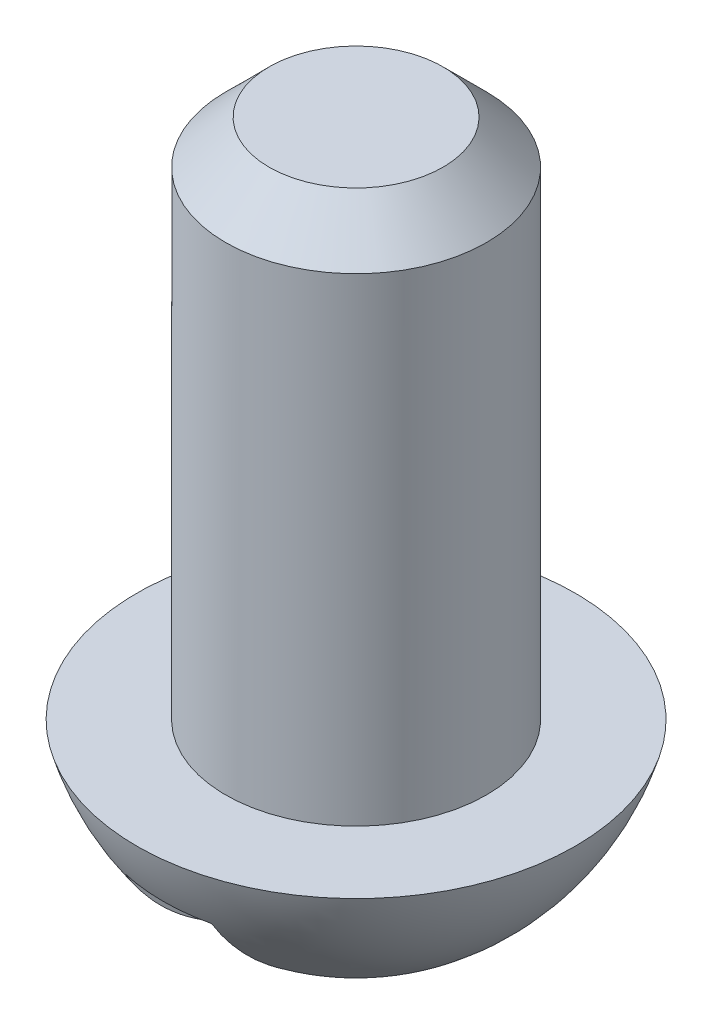
ISO-10303-21;
HEADER;
FILE_DESCRIPTION(('STEP AP214'),'2;1');
FILE_NAME('part.step','',(''),(''),'','','');
FILE_SCHEMA(('AUTOMOTIVE_DESIGN { 1 0 10303 214 1 1 1 1 }'));
ENDSEC;
DATA;
#1=APPLICATION_CONTEXT('core data for automotive mechanical design processes');
#2=APPLICATION_PROTOCOL_DEFINITION('international standard','automotive_design',2000,#1);
#3=PRODUCT_CONTEXT('',#1,'mechanical');
#4=PRODUCT('Part','Part','',(#3));
#5=PRODUCT_RELATED_PRODUCT_CATEGORY('part','',(#4));
#6=PRODUCT_DEFINITION_FORMATION('','',#4);
#7=PRODUCT_DEFINITION_CONTEXT('part definition',#1,'design');
#8=PRODUCT_DEFINITION('design','',#6,#7);
#9=PRODUCT_DEFINITION_SHAPE('','',#8);
#10=(LENGTH_UNIT() NAMED_UNIT(*) SI_UNIT(.MILLI.,.METRE.));
#11=(NAMED_UNIT(*) PLANE_ANGLE_UNIT() SI_UNIT($,.RADIAN.));
#12=(NAMED_UNIT(*) SI_UNIT($,.STERADIAN.) SOLID_ANGLE_UNIT());
#13=UNCERTAINTY_MEASURE_WITH_UNIT(LENGTH_MEASURE(1.E-05),#10,'distance_accuracy_value','');
#14=(GEOMETRIC_REPRESENTATION_CONTEXT(3) GLOBAL_UNCERTAINTY_ASSIGNED_CONTEXT((#13)) GLOBAL_UNIT_ASSIGNED_CONTEXT((#10,
#11,#12)) REPRESENTATION_CONTEXT('',''));
#15=CARTESIAN_POINT('',(0.,0.,0.));
#16=DIRECTION('',(0.,0.,1.));
#17=DIRECTION('',(1.,0.,0.));
#18=AXIS2_PLACEMENT_3D('',#15,#16,#17);
#19=CARTESIAN_POINT('',(0.,6.,0.));
#20=DIRECTION('',(0.,-1.,0.));
#21=DIRECTION('',(0.,0.,-1.));
#22=AXIS2_PLACEMENT_3D('',#19,#20,#21);
#23=CYLINDRICAL_SURFACE('',#22,1.5);
#24=CARTESIAN_POINT('',(0.,5.5,0.));
#25=DIRECTION('',(0.,1.,0.));
#26=DIRECTION('',(0.,0.,1.));
#27=AXIS2_PLACEMENT_3D('',#24,#25,#26);
#28=CIRCLE('',#27,1.5);
#29=CARTESIAN_POINT('',(0.,5.5,1.5));
#30=VERTEX_POINT('',#29);
#31=EDGE_CURVE('E11',#30,#30,#28,.F.);
#32=ORIENTED_EDGE('',*,*,#31,.T.);
#33=EDGE_LOOP('',(#32));
#34=FACE_BOUND('',#33,.T.);
#35=CARTESIAN_POINT('',(0.,0.,0.));
#36=DIRECTION('',(0.,-1.,0.));
#37=DIRECTION('',(1.,0.,0.));
#38=AXIS2_PLACEMENT_3D('',#35,#36,#37);
#39=CIRCLE('',#38,1.5);
#40=CARTESIAN_POINT('',(1.5,0.,0.));
#41=VERTEX_POINT('',#40);
#42=EDGE_CURVE('E65',#41,#41,#39,.T.);
#43=ORIENTED_EDGE('',*,*,#42,.F.);
#44=EDGE_LOOP('',(#43));
#45=FACE_BOUND('',#44,.T.);
#46=ADVANCED_FACE('F33',(#34,#45),#23,.T.);
#47=CARTESIAN_POINT('',(0.,6.,0.));
#48=DIRECTION('',(0.,1.,0.));
#49=DIRECTION('',(0.,0.,1.));
#50=AXIS2_PLACEMENT_3D('',#47,#48,#49);
#51=PLANE('',#50);
#52=CARTESIAN_POINT('',(0.,6.,0.));
#53=DIRECTION('',(0.,1.,0.));
#54=DIRECTION('',(0.,0.,1.));
#55=AXIS2_PLACEMENT_3D('',#52,#53,#54);
#56=CIRCLE('',#55,1.);
#57=CARTESIAN_POINT('',(0.,6.,1.));
#58=VERTEX_POINT('',#57);
#59=EDGE_CURVE('E41',#58,#58,#56,.T.);
#60=ORIENTED_EDGE('',*,*,#59,.T.);
#61=EDGE_LOOP('',(#60));
#62=FACE_BOUND('',#61,.T.);
#63=ADVANCED_FACE('F98',(#62),#51,.T.);
#64=CARTESIAN_POINT('',(0.,0.,0.));
#65=DIRECTION('',(0.,-1.,0.));
#66=DIRECTION('',(1.,0.,0.));
#67=AXIS2_PLACEMENT_3D('',#64,#65,#66);
#68=PLANE('',#67);
#69=CARTESIAN_POINT('',(0.,0.,0.));
#70=DIRECTION('',(0.,-1.,0.));
#71=DIRECTION('',(1.,0.,0.));
#72=AXIS2_PLACEMENT_3D('',#69,#70,#71);
#73=CIRCLE('',#72,2.52);
#74=CARTESIAN_POINT('',(2.52,0.,0.));
#75=VERTEX_POINT('',#74);
#76=EDGE_CURVE('E115',#75,#75,#73,.T.);
#77=ORIENTED_EDGE('',*,*,#76,.F.);
#78=EDGE_LOOP('',(#77));
#79=FACE_BOUND('',#78,.T.);
#80=ORIENTED_EDGE('',*,*,#42,.T.);
#81=EDGE_LOOP('',(#80));
#82=FACE_BOUND('',#81,.T.);
#83=ADVANCED_FACE('F103',(#79,#82),#68,.F.);
#84=CARTESIAN_POINT('',(0.,0.787302013422015,0.));
#85=DIRECTION('',(0.,-1.,0.));
#86=DIRECTION('',(1.,0.,0.));
#87=AXIS2_PLACEMENT_3D('',#84,#85,#86);
#88=DEGENERATE_TOROIDAL_SURFACE('',#87,0.271085011185012,2.9,.F.);
#89=CARTESIAN_POINT('',(0.,-0.7,0.));
#90=DIRECTION('',(0.,1.,0.));
#91=DIRECTION('',(0.,0.,1.));
#92=AXIS2_PLACEMENT_3D('',#89,#90,#91);
#93=CIRCLE('',#92,2.21847975416471);
#94=CARTESIAN_POINT('',(0.5,-0.699999999999995,-2.16140056899195));
#95=VERTEX_POINT('',#94);
#96=CARTESIAN_POINT('',(-0.5,-0.7,-2.16140056899195));
#97=VERTEX_POINT('',#96);
#98=EDGE_CURVE('E68',#95,#97,#93,.T.);
#99=ORIENTED_EDGE('',*,*,#98,.T.);
#100=CARTESIAN_POINT('',(-0.5,-2.00830666905231,0.));
#101=CARTESIAN_POINT('',(-0.5,-2.00830902523809,0.0428607928409078));
#102=CARTESIAN_POINT('',(-0.5,-2.00677701447295,0.0857176950793083));
#103=CARTESIAN_POINT('',(-0.5,-2.00077477337984,0.171233621065701));
#104=CARTESIAN_POINT('',(-0.5,-1.99630377029604,0.213892589799023));
#105=CARTESIAN_POINT('',(-0.5,-1.98466835662272,0.298948247700139));
#106=CARTESIAN_POINT('',(-0.5,-1.97749705360507,0.341343981069012));
#107=CARTESIAN_POINT('',(-0.5,-1.96072290989855,0.425642081267895));
#108=CARTESIAN_POINT('',(-0.5,-1.95112019303028,0.467544473107811));
#109=CARTESIAN_POINT('',(-0.5,-1.92223725405787,0.579688450377579));
#110=CARTESIAN_POINT('',(-0.5,-1.90086765384547,0.649401072004694));
#111=CARTESIAN_POINT('',(-0.5,-1.85236077305985,0.786781567721751));
#112=CARTESIAN_POINT('',(-0.5,-1.82522117423046,0.854448607424066));
#113=CARTESIAN_POINT('',(-0.5,-1.7357070685999,1.05388466131537));
#114=CARTESIAN_POINT('',(-0.5,-1.66523008748747,1.18211541524716));
#115=CARTESIAN_POINT('',(-0.5,-1.50332276109899,1.42879594104105));
#116=CARTESIAN_POINT('',(-0.5,-1.41144141201418,1.54694726231623));
#117=CARTESIAN_POINT('',(-0.5,-1.21021633244569,1.76722278518401));
#118=CARTESIAN_POINT('',(-0.5,-1.10087932958539,1.86935313151299));
#119=CARTESIAN_POINT('',(-0.5,-0.860273080352937,2.06091763689049));
#120=CARTESIAN_POINT('',(-0.5,-0.728065620900349,2.14917595333445));
#121=CARTESIAN_POINT('',(-0.5,-0.450766012338848,2.30248024074104));
#122=CARTESIAN_POINT('',(-0.5,-0.305669223995743,2.36751781128017));
#123=CARTESIAN_POINT('',(-0.5,-0.00545444206719077,2.47298771259921));
#124=CARTESIAN_POINT('',(-0.5,0.149735660014806,2.5132149447268));
#125=CARTESIAN_POINT('',(-0.5,0.464641057680149,2.5670929362687));
#126=CARTESIAN_POINT('',(-0.5,0.624355819321792,2.58074681838075));
#127=CARTESIAN_POINT('',(-0.5,0.944113367836459,2.58110769648025));
#128=CARTESIAN_POINT('',(-0.5,1.10415621408669,2.56776470732811));
#129=CARTESIAN_POINT('',(-0.5,1.41977014581319,2.51439805056066));
#130=CARTESIAN_POINT('',(-0.5,1.57534014413412,2.47436795270612));
#131=CARTESIAN_POINT('',(-0.5,1.87759317317978,2.36872901137911));
#132=CARTESIAN_POINT('',(-0.5,2.02427341433807,2.30311218643132));
#133=CARTESIAN_POINT('',(-0.5,2.30440826785885,2.14818904246711));
#134=CARTESIAN_POINT('',(-0.5,2.43787250242996,2.05890013523032));
#135=CARTESIAN_POINT('',(-0.5,2.68754734098064,1.85936927954692));
#136=CARTESIAN_POINT('',(-0.5,2.80379777448819,1.749177090265));
#137=CARTESIAN_POINT('',(-0.5,3.01629762837255,1.51039076171608));
#138=CARTESIAN_POINT('',(-0.5,3.11250355365943,1.38175760649792));
#139=CARTESIAN_POINT('',(-0.5,3.23887493368555,1.17844480477896));
#140=CARTESIAN_POINT('',(-0.5,3.27792862814773,1.10914525185096));
#141=CARTESIAN_POINT('',(-0.5,3.34988755890216,0.967377816270646));
#142=CARTESIAN_POINT('',(-0.5,3.38279161292058,0.894909327685369));
#143=CARTESIAN_POINT('',(-0.5,3.44187516124072,0.747575307035428));
#144=CARTESIAN_POINT('',(-0.5,3.46807767101522,0.672718999882114));
#145=CARTESIAN_POINT('',(-0.5,3.51328086602252,0.520852572751832));
#146=CARTESIAN_POINT('',(-0.5,3.5322838918378,0.443843161515936));
#147=CARTESIAN_POINT('',(-0.5,3.55768578585015,0.310579540568608));
#148=CARTESIAN_POINT('',(-0.5,3.5661370787378,0.254715818046524));
#149=CARTESIAN_POINT('',(-0.5,3.57816501396867,0.142485469182349));
#150=CARTESIAN_POINT('',(-0.5,3.58174514159116,0.0861192314817943));
#151=CARTESIAN_POINT('',(-0.5,3.58358888853252,-0.0266645197386601));
#152=CARTESIAN_POINT('',(-0.5,3.58185618571465,-0.0830819707704476));
#153=CARTESIAN_POINT('',(-0.5,3.57331877582221,-0.195548634576939));
#154=CARTESIAN_POINT('',(-0.5,3.56651103425344,-0.251597606793419));
#155=CARTESIAN_POINT('',(-0.5,3.54637785420933,-0.375782803539229));
#156=CARTESIAN_POINT('',(-0.5,3.5319131113656,-0.443732633884875));
#157=CARTESIAN_POINT('',(-0.5,3.49718633392172,-0.578125062699261));
#158=CARTESIAN_POINT('',(-0.5,3.47692300041911,-0.644567319863809));
#159=CARTESIAN_POINT('',(-0.5,3.43105557355988,-0.775837565642575));
#160=CARTESIAN_POINT('',(-0.5,3.40543329582803,-0.840659194226015));
#161=CARTESIAN_POINT('',(-0.5,3.34926248124926,-0.968098039765201));
#162=CARTESIAN_POINT('',(-0.5,3.31871469013967,-1.03071558867944));
#163=CARTESIAN_POINT('',(-0.5,3.21919823082042,-1.216454526155));
#164=CARTESIAN_POINT('',(-0.5,3.14295294179025,-1.33577533609196));
#165=CARTESIAN_POINT('',(-0.5,2.97362070509193,-1.56133292921711));
#166=CARTESIAN_POINT('',(-0.5,2.88056481387892,-1.66759324245783));
#167=CARTESIAN_POINT('',(-0.5,2.66793948747481,-1.87659633287979));
#168=CARTESIAN_POINT('',(-0.5,2.54654543403006,-1.97749429271548));
#169=CARTESIAN_POINT('',(-0.5,2.28862110586937,-2.15788733905101));
#170=CARTESIAN_POINT('',(-0.5,2.15207512678454,-2.2373599209244));
#171=CARTESIAN_POINT('',(-0.5,1.86583734923645,-2.37352878804972));
#172=CARTESIAN_POINT('',(-0.5,1.71599605796425,-2.42991120492598));
#173=CARTESIAN_POINT('',(-0.5,1.40903330432197,-2.5167871749865));
#174=CARTESIAN_POINT('',(-0.5,1.25191367325997,-2.54728720354392));
#175=CARTESIAN_POINT('',(-0.5,0.934290181022326,-2.58162938572399));
#176=CARTESIAN_POINT('',(-0.5,0.773777309344931,-2.58538828009068));
#177=CARTESIAN_POINT('',(-0.5,0.454382437326888,-2.56592048393626));
#178=CARTESIAN_POINT('',(-0.5,0.295500587091198,-2.54269133173875));
#179=CARTESIAN_POINT('',(-0.5,-0.0161898657472835,-2.4698761216843));
#180=CARTESIAN_POINT('',(-0.5,-0.168995378013231,-2.42027683206015));
#181=CARTESIAN_POINT('',(-0.5,-0.464091287042087,-2.29610912288206));
#182=CARTESIAN_POINT('',(-0.5,-0.606382220836688,-2.22154197963776));
#183=CARTESIAN_POINT('',(-0.5,-0.876260298813449,-2.04960277928083));
#184=CARTESIAN_POINT('',(-0.5,-1.00386164773157,-1.95225303390011));
#185=CARTESIAN_POINT('',(-0.5,-1.24082238448772,-1.73744423057207));
#186=CARTESIAN_POINT('',(-0.5,-1.35018077277265,-1.61998407146574));
#187=CARTESIAN_POINT('',(-0.5,-1.54695971528993,-1.36869643690514));
#188=CARTESIAN_POINT('',(-0.5,-1.63448083863165,-1.23494837977945));
#189=CARTESIAN_POINT('',(-0.5,-1.74748301022448,-1.02460752044256));
#190=CARTESIAN_POINT('',(-0.5,-1.7821277229314,-0.952802126809185));
#191=CARTESIAN_POINT('',(-0.5,-1.84490049228109,-0.806412377112441));
#192=CARTESIAN_POINT('',(-0.5,-1.8730328170853,-0.731829878564861));
#193=CARTESIAN_POINT('',(-0.5,-1.91484944880954,-0.603033392826844));
#194=CARTESIAN_POINT('',(-0.5,-1.93033848924262,-0.549398661873268));
#195=CARTESIAN_POINT('',(-0.5,-1.95752526788402,-0.441168906034976));
#196=CARTESIAN_POINT('',(-0.5,-1.96922330554232,-0.386573957356848));
#197=CARTESIAN_POINT('',(-0.5,-1.98831800484734,-0.276860890273204));
#198=CARTESIAN_POINT('',(-0.5,-1.99573246011595,-0.221745916878929));
#199=CARTESIAN_POINT('',(-0.5,-2.00572419134632,-0.111084983102166));
#200=CARTESIAN_POINT('',(-0.5,-2.00830361589523,-0.05553922517566));
#201=CARTESIAN_POINT('',(-0.5,-2.00830666905231,0.));
#202=B_SPLINE_CURVE_WITH_KNOTS('',3,(#100,#101,#102,#103,#104,#105,#106,#107,#108,#109,#110,
#111,#112,#113,#114,#115,#116,#117,#118,#119,#120,#121,#122,#123,#124,#125,#126,#127,#128,#129,
#130,#131,#132,#133,#134,#135,#136,#137,#138,#139,#140,#141,#142,#143,#144,#145,#146,#147,#148,
#149,#150,#151,#152,#153,#154,#155,#156,#157,#158,#159,#160,#161,#162,#163,#164,#165,#166,#167,
#168,#169,#170,#171,#172,#173,#174,#175,#176,#177,#178,#179,#180,#181,#182,#183,#184,#185,#186,
#187,#188,#189,#190,#191,#192,#193,#194,#195,#196,#197,#198,#199,#200,#201),.UNSPECIFIED.,.T.,
.F.,(4,2,2,2,2,2,2,2,2,2,2,2,2,2,2,2,2,2,2,2,2,2,2,2,2,2,2,2,2,2,2,2,2,2,2,2,2,2,2,2,2,2,2,2,2,
2,2,2,2,2,4),(0.,0.128549890420901,0.257133594278979,0.38604775350707,0.514955349056843,
0.733388158692688,0.951908896149971,1.38886811132146,1.83603449032034,2.2830289401214,
2.75766808537321,3.23247876428289,3.7111637009508,4.18979238281254,4.66930806427601,
5.14893932646848,5.62872032377173,6.10814939702517,6.5864512193134,7.06578035331483,
7.30417625808895,7.54261794764793,7.78022940177217,8.01776354099072,8.18708446097374,
8.35628416939137,8.52536677396586,8.69455055848108,8.90266478459222,9.1108256654822,
9.3197046989318,9.52855213712079,9.95155880225897,10.3737918375563,10.8451078962781,
11.3169171004645,11.7949423106178,12.2728478909701,12.7522407948426,13.2316774292923,
13.7113548584433,14.19100777113,14.6701928956692,15.149404266703,15.6263661627454,
15.8652960746778,16.1040689478955,16.2714320712356,16.4387819713975,16.6054316218962,
16.7720071991818),.UNSPECIFIED.);
#203=CARTESIAN_POINT('',(-0.5,-0.7,2.16140056899195));
#204=VERTEX_POINT('',#203);
#205=EDGE_CURVE('E74',#97,#204,#202,.T.);
#206=ORIENTED_EDGE('',*,*,#205,.T.);
#207=CARTESIAN_POINT('',(0.5,-0.7,2.16140056899192));
#208=VERTEX_POINT('',#207);
#209=EDGE_CURVE('E54',#204,#208,#93,.T.);
#210=ORIENTED_EDGE('',*,*,#209,.T.);
#211=CARTESIAN_POINT('',(0.5,-2.00830666905231,0.));
#212=CARTESIAN_POINT('',(0.5,-2.00830902523809,-0.0428607928409077));
#213=CARTESIAN_POINT('',(0.5,-2.00677701447295,-0.0857176950793083));
#214=CARTESIAN_POINT('',(0.5,-2.00077477337984,-0.171233621065701));
#215=CARTESIAN_POINT('',(0.5,-1.99630377029604,-0.213892589799023));
#216=CARTESIAN_POINT('',(0.5,-1.98466835662272,-0.298948247700139));
#217=CARTESIAN_POINT('',(0.5,-1.97749705360507,-0.341343981069012));
#218=CARTESIAN_POINT('',(0.5,-1.96072290989855,-0.425642081267895));
#219=CARTESIAN_POINT('',(0.5,-1.95112019303028,-0.467544473107811));
#220=CARTESIAN_POINT('',(0.5,-1.92223725405787,-0.579688450377579));
#221=CARTESIAN_POINT('',(0.5,-1.90086765384547,-0.649401072004694));
#222=CARTESIAN_POINT('',(0.5,-1.85236077305985,-0.786781567721752));
#223=CARTESIAN_POINT('',(0.5,-1.82522117423046,-0.854448607424066));
#224=CARTESIAN_POINT('',(0.5,-1.7357070685999,-1.05388466131537));
#225=CARTESIAN_POINT('',(0.5,-1.66523008748747,-1.18211541524716));
#226=CARTESIAN_POINT('',(0.5,-1.50332276109899,-1.42879594104105));
#227=CARTESIAN_POINT('',(0.5,-1.41144141201418,-1.54694726231623));
#228=CARTESIAN_POINT('',(0.5,-1.21021633244569,-1.76722278518401));
#229=CARTESIAN_POINT('',(0.5,-1.10087932958539,-1.86935313151299));
#230=CARTESIAN_POINT('',(0.5,-0.860273080352937,-2.06091763689049));
#231=CARTESIAN_POINT('',(0.5,-0.728065620900348,-2.14917595333445));
#232=CARTESIAN_POINT('',(0.5,-0.450766012338847,-2.30248024074104));
#233=CARTESIAN_POINT('',(0.5,-0.305669223995742,-2.36751781128017));
#234=CARTESIAN_POINT('',(0.5,-0.00545444206719042,-2.47298771259921));
#235=CARTESIAN_POINT('',(0.5,0.149735660014806,-2.5132149447268));
#236=CARTESIAN_POINT('',(0.5,0.46464105768015,-2.5670929362687));
#237=CARTESIAN_POINT('',(0.5,0.624355819321793,-2.58074681838075));
#238=CARTESIAN_POINT('',(0.5,0.94411336783646,-2.58110769648025));
#239=CARTESIAN_POINT('',(0.5,1.10415621408669,-2.56776470732811));
#240=CARTESIAN_POINT('',(0.5,1.41977014581319,-2.51439805056066));
#241=CARTESIAN_POINT('',(0.5,1.57534014413412,-2.47436795270612));
#242=CARTESIAN_POINT('',(0.5,1.87759317317978,-2.36872901137911));
#243=CARTESIAN_POINT('',(0.499999999999999,2.02427341433807,-2.30311218643132));
#244=CARTESIAN_POINT('',(0.499999999999999,2.30440826785885,-2.1481890424671));
#245=CARTESIAN_POINT('',(0.499999999999999,2.43787250242996,-2.05890013523032));
#246=CARTESIAN_POINT('',(0.499999999999999,2.68754734098064,-1.85936927954692));
#247=CARTESIAN_POINT('',(0.499999999999999,2.80379777448819,-1.749177090265));
#248=CARTESIAN_POINT('',(0.499999999999999,3.01629762837255,-1.51039076171608));
#249=CARTESIAN_POINT('',(0.499999999999999,3.11250355365943,-1.38175760649792));
#250=CARTESIAN_POINT('',(0.499999999999999,3.23887493368555,-1.17844480477896));
#251=CARTESIAN_POINT('',(0.499999999999999,3.27792862814773,-1.10914525185096));
#252=CARTESIAN_POINT('',(0.499999999999999,3.34988755890216,-0.967377816270646));
#253=CARTESIAN_POINT('',(0.499999999999999,3.38279161292058,-0.89490932768537));
#254=CARTESIAN_POINT('',(0.499999999999999,3.44187516124072,-0.747575307035428));
#255=CARTESIAN_POINT('',(0.499999999999999,3.46807767101522,-0.672718999882114));
#256=CARTESIAN_POINT('',(0.499999999999999,3.51328086602252,-0.520852572751832));
#257=CARTESIAN_POINT('',(0.499999999999999,3.5322838918378,-0.443843161515936));
#258=CARTESIAN_POINT('',(0.499999999999999,3.55768578585015,-0.310579540568608));
#259=CARTESIAN_POINT('',(0.499999999999999,3.5661370787378,-0.254715818046524));
#260=CARTESIAN_POINT('',(0.499999999999999,3.57816501396867,-0.142485469182349));
#261=CARTESIAN_POINT('',(0.499999999999999,3.58174514159116,-0.0861192314817943));
#262=CARTESIAN_POINT('',(0.499999999999999,3.58358888853252,0.0266645197386601));
#263=CARTESIAN_POINT('',(0.499999999999999,3.58185618571465,0.0830819707704476));
#264=CARTESIAN_POINT('',(0.499999999999999,3.57331877582221,0.195548634576939));
#265=CARTESIAN_POINT('',(0.499999999999999,3.56651103425344,0.251597606793419));
#266=CARTESIAN_POINT('',(0.499999999999999,3.54637785420933,0.375782803539229));
#267=CARTESIAN_POINT('',(0.499999999999999,3.5319131113656,0.443732633884875));
#268=CARTESIAN_POINT('',(0.499999999999999,3.49718633392172,0.578125062699261));
#269=CARTESIAN_POINT('',(0.499999999999999,3.47692300041911,0.64456731986381));
#270=CARTESIAN_POINT('',(0.499999999999999,3.43105557355988,0.775837565642575));
#271=CARTESIAN_POINT('',(0.499999999999999,3.40543329582803,0.840659194226015));
#272=CARTESIAN_POINT('',(0.499999999999999,3.34926248124926,0.968098039765201));
#273=CARTESIAN_POINT('',(0.499999999999999,3.31871469013967,1.03071558867944));
#274=CARTESIAN_POINT('',(0.499999999999999,3.21919823082042,1.216454526155));
#275=CARTESIAN_POINT('',(0.499999999999999,3.14295294179025,1.33577533609196));
#276=CARTESIAN_POINT('',(0.499999999999999,2.97362070509193,1.56133292921711));
#277=CARTESIAN_POINT('',(0.499999999999999,2.88056481387892,1.66759324245783));
#278=CARTESIAN_POINT('',(0.499999999999999,2.66793948747481,1.87659633287979));
#279=CARTESIAN_POINT('',(0.499999999999999,2.54654543403006,1.97749429271548));
#280=CARTESIAN_POINT('',(0.499999999999999,2.28862110586937,2.15788733905101));
#281=CARTESIAN_POINT('',(0.499999999999999,2.15207512678454,2.2373599209244));
#282=CARTESIAN_POINT('',(0.499999999999999,1.86583734923645,2.37352878804972));
#283=CARTESIAN_POINT('',(0.5,1.71599605796425,2.42991120492598));
#284=CARTESIAN_POINT('',(0.5,1.40903330432198,2.5167871749865));
#285=CARTESIAN_POINT('',(0.5,1.25191367325997,2.54728720354392));
#286=CARTESIAN_POINT('',(0.5,0.934290181022327,2.58162938572399));
#287=CARTESIAN_POINT('',(0.5,0.773777309344932,2.58538828009068));
#288=CARTESIAN_POINT('',(0.5,0.454382437326889,2.56592048393626));
#289=CARTESIAN_POINT('',(0.5,0.295500587091199,2.54269133173875));
#290=CARTESIAN_POINT('',(0.5,-0.0161898657472827,2.4698761216843));
#291=CARTESIAN_POINT('',(0.5,-0.16899537801323,2.42027683206015));
#292=CARTESIAN_POINT('',(0.5,-0.464091287042086,2.29610912288206));
#293=CARTESIAN_POINT('',(0.5,-0.606382220836687,2.22154197963777));
#294=CARTESIAN_POINT('',(0.5,-0.876260298813447,2.04960277928083));
#295=CARTESIAN_POINT('',(0.5,-1.00386164773157,1.95225303390012));
#296=CARTESIAN_POINT('',(0.5,-1.24082238448772,1.73744423057207));
#297=CARTESIAN_POINT('',(0.5,-1.35018077277265,1.61998407146574));
#298=CARTESIAN_POINT('',(0.5,-1.54695971528993,1.36869643690514));
#299=CARTESIAN_POINT('',(0.5,-1.63448083863165,1.23494837977945));
#300=CARTESIAN_POINT('',(0.5,-1.74748301022448,1.02460752044256));
#301=CARTESIAN_POINT('',(0.5,-1.7821277229314,0.952802126809186));
#302=CARTESIAN_POINT('',(0.5,-1.84490049228109,0.806412377112441));
#303=CARTESIAN_POINT('',(0.5,-1.8730328170853,0.731829878564862));
#304=CARTESIAN_POINT('',(0.5,-1.91484944880954,0.603033392826845));
#305=CARTESIAN_POINT('',(0.5,-1.93033848924262,0.549398661873269));
#306=CARTESIAN_POINT('',(0.5,-1.95752526788402,0.441168906034977));
#307=CARTESIAN_POINT('',(0.5,-1.96922330554232,0.38657395735685));
#308=CARTESIAN_POINT('',(0.5,-1.98831800484734,0.276860890273205));
#309=CARTESIAN_POINT('',(0.5,-1.99573246011595,0.221745916878929));
#310=CARTESIAN_POINT('',(0.5,-2.00572419134632,0.111084983102165));
#311=CARTESIAN_POINT('',(0.5,-2.00830361589523,0.0555392251756597));
#312=CARTESIAN_POINT('',(0.5,-2.00830666905231,0.));
#313=B_SPLINE_CURVE_WITH_KNOTS('',3,(#211,#212,#213,#214,#215,#216,#217,#218,#219,#220,#221,
#222,#223,#224,#225,#226,#227,#228,#229,#230,#231,#232,#233,#234,#235,#236,#237,#238,#239,#240,
#241,#242,#243,#244,#245,#246,#247,#248,#249,#250,#251,#252,#253,#254,#255,#256,#257,#258,#259,
#260,#261,#262,#263,#264,#265,#266,#267,#268,#269,#270,#271,#272,#273,#274,#275,#276,#277,#278,
#279,#280,#281,#282,#283,#284,#285,#286,#287,#288,#289,#290,#291,#292,#293,#294,#295,#296,#297,
#298,#299,#300,#301,#302,#303,#304,#305,#306,#307,#308,#309,#310,#311,#312),.UNSPECIFIED.,.T.,
.F.,(4,2,2,2,2,2,2,2,2,2,2,2,2,2,2,2,2,2,2,2,2,2,2,2,2,2,2,2,2,2,2,2,2,2,2,2,2,2,2,2,2,2,2,2,2,
2,2,2,2,2,4),(0.,0.128549890420901,0.257133594278978,0.38604775350707,0.514955349056843,
0.733388158692688,0.951908896149971,1.38886811132146,1.83603449032035,2.2830289401214,
2.75766808537321,3.23247876428289,3.7111637009508,4.18979238281254,4.66930806427601,
5.14893932646848,5.62872032377173,6.10814939702517,6.5864512193134,7.06578035331483,
7.30417625808895,7.54261794764793,7.78022940177217,8.01776354099073,8.18708446097374,
8.35628416939137,8.52536677396586,8.69455055848108,8.90266478459222,9.1108256654822,
9.3197046989318,9.52855213712079,9.95155880225897,10.3737918375563,10.8451078962781,
11.3169171004645,11.7949423106178,12.2728478909701,12.7522407948426,13.2316774292923,
13.7113548584433,14.19100777113,14.6701928956692,15.149404266703,15.6263661627454,
15.8652960746778,16.1040689478955,16.2714320712356,16.4387819713975,16.6054316218962,
16.7720071991818),.UNSPECIFIED.);
#314=EDGE_CURVE('E61',#208,#95,#313,.T.);
#315=ORIENTED_EDGE('',*,*,#314,.T.);
#316=EDGE_LOOP('',(#99,#206,#210,#315));
#317=FACE_BOUND('',#316,.T.);
#318=ORIENTED_EDGE('',*,*,#76,.T.);
#319=EDGE_LOOP('',(#318));
#320=FACE_BOUND('',#319,.T.);
#321=ADVANCED_FACE('F72',(#317,#320),#88,.F.);
#322=CARTESIAN_POINT('',(-0.5,-4.63806179955192,-2.52));
#323=DIRECTION('',(-1.,0.,0.));
#324=DIRECTION('',(0.,0.,1.));
#325=AXIS2_PLACEMENT_3D('',#322,#323,#324);
#326=PLANE('',#325);
#327=DIRECTION('',(0.,0.,1.));
#328=VECTOR('',#327,1.);
#329=CARTESIAN_POINT('',(-0.5,-0.7,-2.52));
#330=LINE('',#329,#328);
#331=EDGE_CURVE('E69',#97,#204,#330,.T.);
#332=ORIENTED_EDGE('',*,*,#331,.T.);
#333=ORIENTED_EDGE('',*,*,#205,.F.);
#334=EDGE_LOOP('',(#332,#333));
#335=FACE_BOUND('',#334,.T.);
#336=ADVANCED_FACE('F87',(#335),#326,.F.);
#337=CARTESIAN_POINT('',(-0.5,-0.7,-2.52));
#338=DIRECTION('',(0.,1.,0.));
#339=DIRECTION('',(0.,0.,1.));
#340=AXIS2_PLACEMENT_3D('',#337,#338,#339);
#341=PLANE('',#340);
#342=DIRECTION('',(0.,0.,1.));
#343=VECTOR('',#342,1.);
#344=CARTESIAN_POINT('',(0.5,-0.7,-2.52));
#345=LINE('',#344,#343);
#346=EDGE_CURVE('E47',#95,#208,#345,.T.);
#347=ORIENTED_EDGE('',*,*,#346,.T.);
#348=ORIENTED_EDGE('',*,*,#209,.F.);
#349=ORIENTED_EDGE('',*,*,#331,.F.);
#350=ORIENTED_EDGE('',*,*,#98,.F.);
#351=EDGE_LOOP('',(#347,#348,#349,#350));
#352=FACE_BOUND('',#351,.T.);
#353=ADVANCED_FACE('F67',(#352),#341,.F.);
#354=CARTESIAN_POINT('',(0.5,-0.7,-2.52));
#355=DIRECTION('',(1.,0.,0.));
#356=DIRECTION('',(0.,1.,0.));
#357=AXIS2_PLACEMENT_3D('',#354,#355,#356);
#358=PLANE('',#357);
#359=ORIENTED_EDGE('',*,*,#346,.F.);
#360=ORIENTED_EDGE('',*,*,#314,.F.);
#361=EDGE_LOOP('',(#359,#360));
#362=FACE_BOUND('',#361,.T.);
#363=ADVANCED_FACE('F62',(#362),#358,.F.);
#364=CARTESIAN_POINT('',(0.,6.,0.));
#365=DIRECTION('',(0.,-1.,0.));
#366=DIRECTION('',(0.,0.,-1.));
#367=AXIS2_PLACEMENT_3D('',#364,#365,#366);
#368=CONICAL_SURFACE('',#367,1.,0.785398163397446);
#369=ORIENTED_EDGE('',*,*,#31,.F.);
#370=EDGE_LOOP('',(#369));
#371=FACE_BOUND('',#370,.T.);
#372=ORIENTED_EDGE('',*,*,#59,.F.);
#373=EDGE_LOOP('',(#372));
#374=FACE_BOUND('',#373,.T.);
#375=ADVANCED_FACE('F35',(#371,#374),#368,.T.);
#376=CLOSED_SHELL('',(#46,#63,#83,#321,#336,#353,#363,#375));
#377=MANIFOLD_SOLID_BREP('B2',#376);
#378=ADVANCED_BREP_SHAPE_REPRESENTATION('',(#18,#377),#14);
#379=SHAPE_DEFINITION_REPRESENTATION(#9,#378);
ENDSEC;
END-ISO-10303-21;
